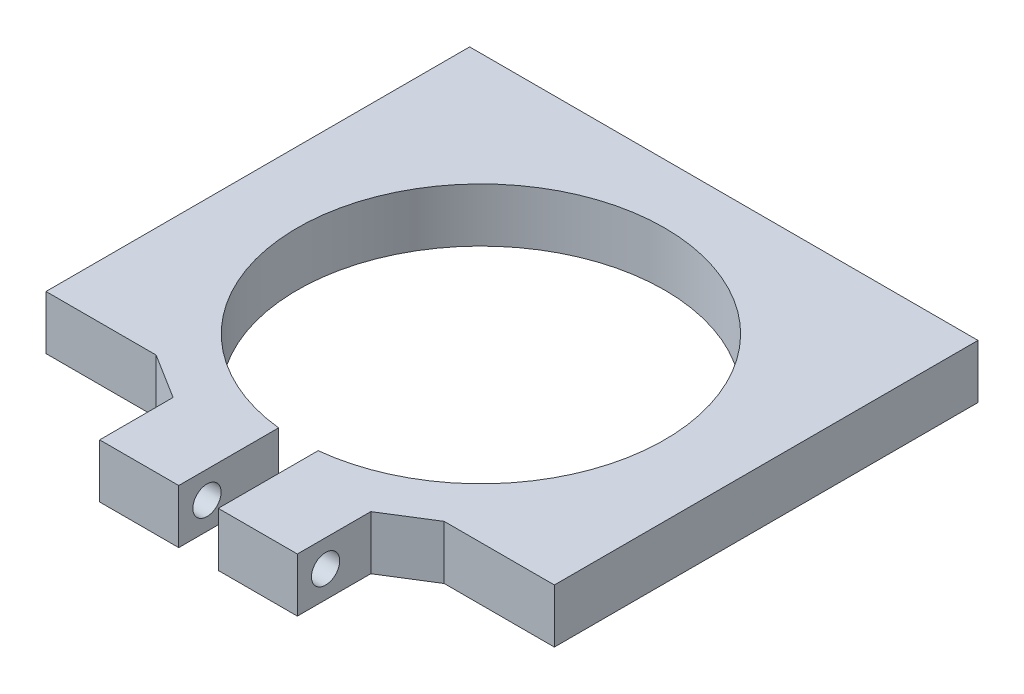
ISO-10303-21;
HEADER;
FILE_DESCRIPTION(('STEP AP214'),'2;1');
FILE_NAME('part.step','',(''),(''),'','','');
FILE_SCHEMA(('AUTOMOTIVE_DESIGN { 1 0 10303 214 1 1 1 1 }'));
ENDSEC;
DATA;
#1=APPLICATION_CONTEXT('core data for automotive mechanical design processes');
#2=APPLICATION_PROTOCOL_DEFINITION('international standard','automotive_design',2000,#1);
#3=PRODUCT_CONTEXT('',#1,'mechanical');
#4=PRODUCT('Part','Part','',(#3));
#5=PRODUCT_RELATED_PRODUCT_CATEGORY('part','',(#4));
#6=PRODUCT_DEFINITION_FORMATION('','',#4);
#7=PRODUCT_DEFINITION_CONTEXT('part definition',#1,'design');
#8=PRODUCT_DEFINITION('design','',#6,#7);
#9=PRODUCT_DEFINITION_SHAPE('','',#8);
#10=(LENGTH_UNIT() NAMED_UNIT(*) SI_UNIT(.MILLI.,.METRE.));
#11=(NAMED_UNIT(*) PLANE_ANGLE_UNIT() SI_UNIT($,.RADIAN.));
#12=(NAMED_UNIT(*) SI_UNIT($,.STERADIAN.) SOLID_ANGLE_UNIT());
#13=UNCERTAINTY_MEASURE_WITH_UNIT(LENGTH_MEASURE(1.E-05),#10,'distance_accuracy_value','');
#14=(GEOMETRIC_REPRESENTATION_CONTEXT(3) GLOBAL_UNCERTAINTY_ASSIGNED_CONTEXT((#13)) GLOBAL_UNIT_ASSIGNED_CONTEXT((#10,
#11,#12)) REPRESENTATION_CONTEXT('',''));
#15=CARTESIAN_POINT('',(0.,0.,0.));
#16=DIRECTION('',(0.,0.,1.));
#17=DIRECTION('',(1.,0.,0.));
#18=AXIS2_PLACEMENT_3D('',#15,#16,#17);
#19=CARTESIAN_POINT('',(-45.,9.53,46.5));
#20=DIRECTION('',(0.,0.,-1.));
#21=DIRECTION('',(-1.,0.,0.));
#22=AXIS2_PLACEMENT_3D('',#19,#20,#21);
#23=PLANE('',#22);
#24=DIRECTION('',(1.,0.,0.));
#25=VECTOR('',#24,1.);
#26=CARTESIAN_POINT('',(-45.,9.53,46.5));
#27=LINE('',#26,#25);
#28=CARTESIAN_POINT('',(3.50000000000001,9.53,46.5));
#29=VERTEX_POINT('',#28);
#30=CARTESIAN_POINT('',(17.5,9.53,46.5));
#31=VERTEX_POINT('',#30);
#32=EDGE_CURVE('E263',#29,#31,#27,.T.);
#33=ORIENTED_EDGE('',*,*,#32,.F.);
#34=DIRECTION('',(0.,1.,0.));
#35=VECTOR('',#34,1.);
#36=CARTESIAN_POINT('',(3.50000000000001,-0.000999999999999265,46.5));
#37=LINE('',#36,#35);
#38=CARTESIAN_POINT('',(3.50000000000001,0.,46.5));
#39=VERTEX_POINT('',#38);
#40=EDGE_CURVE('E201',#39,#29,#37,.T.);
#41=ORIENTED_EDGE('',*,*,#40,.F.);
#42=DIRECTION('',(1.,0.,0.));
#43=VECTOR('',#42,1.);
#44=CARTESIAN_POINT('',(-45.,0.,46.5));
#45=LINE('',#44,#43);
#46=CARTESIAN_POINT('',(17.5,0.,46.5));
#47=VERTEX_POINT('',#46);
#48=EDGE_CURVE('E272',#39,#47,#45,.T.);
#49=ORIENTED_EDGE('',*,*,#48,.T.);
#50=DIRECTION('',(0.,1.,0.));
#51=VECTOR('',#50,1.);
#52=CARTESIAN_POINT('',(17.5,-0.000999999999999265,46.5));
#53=LINE('',#52,#51);
#54=EDGE_CURVE('E221',#47,#31,#53,.T.);
#55=ORIENTED_EDGE('',*,*,#54,.T.);
#56=EDGE_LOOP('',(#33,#41,#49,#55));
#57=FACE_BOUND('',#56,.T.);
#58=ADVANCED_FACE('F32',(#57),#23,.F.);
#59=CARTESIAN_POINT('',(-45.,9.53,-46.5));
#60=DIRECTION('',(0.,0.,-1.));
#61=DIRECTION('',(-1.,0.,0.));
#62=AXIS2_PLACEMENT_3D('',#59,#60,#61);
#63=PLANE('',#62);
#64=CARTESIAN_POINT('',(-40.0000000000001,4.76500000000001,-46.5));
#65=DIRECTION('',(0.,0.,-1.));
#66=DIRECTION('',(-1.,0.,0.));
#67=AXIS2_PLACEMENT_3D('',#64,#65,#66);
#68=CIRCLE('',#67,2.);
#69=CARTESIAN_POINT('',(-42.0000000000001,4.76500000000001,-46.5));
#70=VERTEX_POINT('',#69);
#71=EDGE_CURVE('E224',#70,#70,#68,.T.);
#72=ORIENTED_EDGE('',*,*,#71,.F.);
#73=EDGE_LOOP('',(#72));
#74=FACE_BOUND('',#73,.T.);
#75=CARTESIAN_POINT('',(-25.,4.765,-46.5));
#76=DIRECTION('',(0.,0.,-1.));
#77=DIRECTION('',(-1.,0.,0.));
#78=AXIS2_PLACEMENT_3D('',#75,#76,#77);
#79=CIRCLE('',#78,2.);
#80=CARTESIAN_POINT('',(-27.,4.765,-46.5));
#81=VERTEX_POINT('',#80);
#82=EDGE_CURVE('E229',#81,#81,#79,.T.);
#83=ORIENTED_EDGE('',*,*,#82,.F.);
#84=EDGE_LOOP('',(#83));
#85=FACE_BOUND('',#84,.T.);
#86=CARTESIAN_POINT('',(25.,4.76499999999999,-46.5));
#87=DIRECTION('',(0.,0.,-1.));
#88=DIRECTION('',(-1.,0.,0.));
#89=AXIS2_PLACEMENT_3D('',#86,#87,#88);
#90=CIRCLE('',#89,2.);
#91=CARTESIAN_POINT('',(23.,4.76499999999999,-46.5));
#92=VERTEX_POINT('',#91);
#93=EDGE_CURVE('E235',#92,#92,#90,.T.);
#94=ORIENTED_EDGE('',*,*,#93,.F.);
#95=EDGE_LOOP('',(#94));
#96=FACE_BOUND('',#95,.T.);
#97=CARTESIAN_POINT('',(39.9999999999999,4.765,-46.5));
#98=DIRECTION('',(0.,0.,-1.));
#99=DIRECTION('',(-1.,0.,0.));
#100=AXIS2_PLACEMENT_3D('',#97,#98,#99);
#101=CIRCLE('',#100,2.);
#102=CARTESIAN_POINT('',(37.9999999999999,4.765,-46.5));
#103=VERTEX_POINT('',#102);
#104=EDGE_CURVE('E241',#103,#103,#101,.T.);
#105=ORIENTED_EDGE('',*,*,#104,.F.);
#106=EDGE_LOOP('',(#105));
#107=FACE_BOUND('',#106,.T.);
#108=DIRECTION('',(1.,0.,0.));
#109=VECTOR('',#108,1.);
#110=CARTESIAN_POINT('',(-45.,0.,-46.5));
#111=LINE('',#110,#109);
#112=CARTESIAN_POINT('',(-45.,0.,-46.5));
#113=VERTEX_POINT('',#112);
#114=CARTESIAN_POINT('',(45.,0.,-46.5));
#115=VERTEX_POINT('',#114);
#116=EDGE_CURVE('E253',#113,#115,#111,.T.);
#117=ORIENTED_EDGE('',*,*,#116,.F.);
#118=DIRECTION('',(0.,-1.,0.));
#119=VECTOR('',#118,1.);
#120=CARTESIAN_POINT('',(-45.,9.53,-46.5));
#121=LINE('',#120,#119);
#122=CARTESIAN_POINT('',(-45.,9.53,-46.5));
#123=VERTEX_POINT('',#122);
#124=EDGE_CURVE('E11',#123,#113,#121,.T.);
#125=ORIENTED_EDGE('',*,*,#124,.F.);
#126=DIRECTION('',(1.,0.,0.));
#127=VECTOR('',#126,1.);
#128=CARTESIAN_POINT('',(-45.,9.53,-46.5));
#129=LINE('',#128,#127);
#130=CARTESIAN_POINT('',(45.,9.53,-46.5));
#131=VERTEX_POINT('',#130);
#132=EDGE_CURVE('E256',#123,#131,#129,.T.);
#133=ORIENTED_EDGE('',*,*,#132,.T.);
#134=DIRECTION('',(0.,-1.,0.));
#135=VECTOR('',#134,1.);
#136=CARTESIAN_POINT('',(45.,9.53,-46.5));
#137=LINE('',#136,#135);
#138=EDGE_CURVE('E41',#131,#115,#137,.T.);
#139=ORIENTED_EDGE('',*,*,#138,.T.);
#140=EDGE_LOOP('',(#117,#125,#133,#139));
#141=FACE_BOUND('',#140,.T.);
#142=ADVANCED_FACE('F34',(#74,#85,#96,#107,#141),#63,.T.);
#143=CARTESIAN_POINT('',(-45.,9.53,-46.5));
#144=DIRECTION('',(1.,0.,0.));
#145=DIRECTION('',(0.,0.,-1.));
#146=AXIS2_PLACEMENT_3D('',#143,#144,#145);
#147=PLANE('',#146);
#148=DIRECTION('',(0.,0.,1.));
#149=VECTOR('',#148,1.);
#150=CARTESIAN_POINT('',(-45.,0.,-46.5));
#151=LINE('',#150,#149);
#152=CARTESIAN_POINT('',(-45.,0.,28.5));
#153=VERTEX_POINT('',#152);
#154=EDGE_CURVE('E260',#113,#153,#151,.T.);
#155=ORIENTED_EDGE('',*,*,#154,.T.);
#156=DIRECTION('',(0.,1.,0.));
#157=VECTOR('',#156,1.);
#158=CARTESIAN_POINT('',(-45.,0.,28.5));
#159=LINE('',#158,#157);
#160=CARTESIAN_POINT('',(-45.,9.53,28.5));
#161=VERTEX_POINT('',#160);
#162=EDGE_CURVE('E177',#153,#161,#159,.T.);
#163=ORIENTED_EDGE('',*,*,#162,.T.);
#164=DIRECTION('',(0.,0.,1.));
#165=VECTOR('',#164,1.);
#166=CARTESIAN_POINT('',(-45.,9.53,-46.5));
#167=LINE('',#166,#165);
#168=EDGE_CURVE('E267',#123,#161,#167,.T.);
#169=ORIENTED_EDGE('',*,*,#168,.F.);
#170=ORIENTED_EDGE('',*,*,#124,.T.);
#171=EDGE_LOOP('',(#155,#163,#169,#170));
#172=FACE_BOUND('',#171,.T.);
#173=ADVANCED_FACE('F286',(#172),#147,.F.);
#174=CARTESIAN_POINT('',(-17.5,0.,46.5));
#175=VERTEX_POINT('',#174);
#176=CARTESIAN_POINT('',(-3.49999999999999,0.,46.5));
#177=VERTEX_POINT('',#176);
#178=EDGE_CURVE('E273',#175,#177,#45,.T.);
#179=ORIENTED_EDGE('',*,*,#178,.T.);
#180=DIRECTION('',(0.,1.,0.));
#181=VECTOR('',#180,1.);
#182=CARTESIAN_POINT('',(-3.49999999999999,-0.000999999999999265,46.5));
#183=LINE('',#182,#181);
#184=CARTESIAN_POINT('',(-3.49999999999999,9.53,46.5));
#185=VERTEX_POINT('',#184);
#186=EDGE_CURVE('E200',#177,#185,#183,.T.);
#187=ORIENTED_EDGE('',*,*,#186,.T.);
#188=CARTESIAN_POINT('',(-17.5,9.53,46.5));
#189=VERTEX_POINT('',#188);
#190=EDGE_CURVE('E264',#189,#185,#27,.T.);
#191=ORIENTED_EDGE('',*,*,#190,.F.);
#192=DIRECTION('',(0.,1.,0.));
#193=VECTOR('',#192,1.);
#194=CARTESIAN_POINT('',(-17.5,-0.000999999999999265,46.5));
#195=LINE('',#194,#193);
#196=EDGE_CURVE('E212',#175,#189,#195,.T.);
#197=ORIENTED_EDGE('',*,*,#196,.F.);
#198=EDGE_LOOP('',(#179,#187,#191,#197));
#199=FACE_BOUND('',#198,.T.);
#200=ADVANCED_FACE('F308',(#199),#23,.F.);
#201=CARTESIAN_POINT('',(45.,9.53,-46.5));
#202=DIRECTION('',(1.,0.,0.));
#203=DIRECTION('',(0.,0.,-1.));
#204=AXIS2_PLACEMENT_3D('',#201,#202,#203);
#205=PLANE('',#204);
#206=DIRECTION('',(0.,1.,0.));
#207=VECTOR('',#206,1.);
#208=CARTESIAN_POINT('',(45.,0.,28.5));
#209=LINE('',#208,#207);
#210=CARTESIAN_POINT('',(45.,0.,28.5));
#211=VERTEX_POINT('',#210);
#212=CARTESIAN_POINT('',(45.,9.53,28.5));
#213=VERTEX_POINT('',#212);
#214=EDGE_CURVE('E143',#211,#213,#209,.T.);
#215=ORIENTED_EDGE('',*,*,#214,.F.);
#216=DIRECTION('',(0.,0.,1.));
#217=VECTOR('',#216,1.);
#218=CARTESIAN_POINT('',(45.,0.,-46.5));
#219=LINE('',#218,#217);
#220=EDGE_CURVE('E158',#115,#211,#219,.T.);
#221=ORIENTED_EDGE('',*,*,#220,.F.);
#222=ORIENTED_EDGE('',*,*,#138,.F.);
#223=DIRECTION('',(0.,0.,1.));
#224=VECTOR('',#223,1.);
#225=CARTESIAN_POINT('',(45.,9.53,-46.5));
#226=LINE('',#225,#224);
#227=EDGE_CURVE('E259',#131,#213,#226,.T.);
#228=ORIENTED_EDGE('',*,*,#227,.T.);
#229=EDGE_LOOP('',(#215,#221,#222,#228));
#230=FACE_BOUND('',#229,.T.);
#231=ADVANCED_FACE('F282',(#230),#205,.T.);
#232=CARTESIAN_POINT('',(45.,9.53,-46.5));
#233=DIRECTION('',(0.,-1.,0.));
#234=DIRECTION('',(0.,0.,-1.));
#235=AXIS2_PLACEMENT_3D('',#232,#233,#234);
#236=PLANE('',#235);
#237=DIRECTION('',(-0.847998304005087,0.,0.529998940003181));
#238=VECTOR('',#237,1.);
#239=CARTESIAN_POINT('',(25.5,9.53,28.5));
#240=LINE('',#239,#238);
#241=CARTESIAN_POINT('',(25.5,9.53,28.5));
#242=VERTEX_POINT('',#241);
#243=CARTESIAN_POINT('',(17.5,9.53,33.5));
#244=VERTEX_POINT('',#243);
#245=EDGE_CURVE('E159',#242,#244,#240,.T.);
#246=ORIENTED_EDGE('',*,*,#245,.F.);
#247=DIRECTION('',(-1.,0.,0.));
#248=VECTOR('',#247,1.);
#249=CARTESIAN_POINT('',(45.,9.53,28.5));
#250=LINE('',#249,#248);
#251=EDGE_CURVE('E140',#213,#242,#250,.T.);
#252=ORIENTED_EDGE('',*,*,#251,.F.);
#253=ORIENTED_EDGE('',*,*,#227,.F.);
#254=ORIENTED_EDGE('',*,*,#132,.F.);
#255=ORIENTED_EDGE('',*,*,#168,.T.);
#256=DIRECTION('',(-1.,0.,0.));
#257=VECTOR('',#256,1.);
#258=CARTESIAN_POINT('',(-45.,9.53,28.5));
#259=LINE('',#258,#257);
#260=CARTESIAN_POINT('',(-25.5,9.53,28.5));
#261=VERTEX_POINT('',#260);
#262=EDGE_CURVE('E170',#261,#161,#259,.T.);
#263=ORIENTED_EDGE('',*,*,#262,.F.);
#264=DIRECTION('',(-0.847998304005087,0.,-0.529998940003181));
#265=VECTOR('',#264,1.);
#266=CARTESIAN_POINT('',(-25.5,9.53,28.5));
#267=LINE('',#266,#265);
#268=CARTESIAN_POINT('',(-17.5,9.53,33.5));
#269=VERTEX_POINT('',#268);
#270=EDGE_CURVE('E164',#269,#261,#267,.T.);
#271=ORIENTED_EDGE('',*,*,#270,.F.);
#272=DIRECTION('',(0.,0.,-1.));
#273=VECTOR('',#272,1.);
#274=CARTESIAN_POINT('',(-17.5,9.53,46.5));
#275=LINE('',#274,#273);
#276=EDGE_CURVE('E209',#189,#269,#275,.T.);
#277=ORIENTED_EDGE('',*,*,#276,.F.);
#278=ORIENTED_EDGE('',*,*,#190,.T.);
#279=DIRECTION('',(0.,0.,1.));
#280=VECTOR('',#279,1.);
#281=CARTESIAN_POINT('',(-3.49999999999999,9.53,46.5));
#282=LINE('',#281,#280);
#283=CARTESIAN_POINT('',(-3.49999999999999,9.53,28.8210473221398));
#284=VERTEX_POINT('',#283);
#285=EDGE_CURVE('E198',#284,#185,#282,.T.);
#286=ORIENTED_EDGE('',*,*,#285,.F.);
#287=CARTESIAN_POINT('',(0.,9.53,-3.49999999999999));
#288=DIRECTION('',(0.,1.,0.));
#289=DIRECTION('',(0.,0.,1.));
#290=AXIS2_PLACEMENT_3D('',#287,#288,#289);
#291=CIRCLE('',#290,32.51);
#292=CARTESIAN_POINT('',(3.50000000000001,9.53,28.8210473221398));
#293=VERTEX_POINT('',#292);
#294=EDGE_CURVE('E247',#293,#284,#291,.T.);
#295=ORIENTED_EDGE('',*,*,#294,.F.);
#296=DIRECTION('',(0.,0.,-1.));
#297=VECTOR('',#296,1.);
#298=CARTESIAN_POINT('',(3.50000000000001,9.53,46.5));
#299=LINE('',#298,#297);
#300=EDGE_CURVE('E49',#29,#293,#299,.T.);
#301=ORIENTED_EDGE('',*,*,#300,.F.);
#302=ORIENTED_EDGE('',*,*,#32,.T.);
#303=DIRECTION('',(0.,0.,1.));
#304=VECTOR('',#303,1.);
#305=CARTESIAN_POINT('',(17.5,9.53,46.5));
#306=LINE('',#305,#304);
#307=EDGE_CURVE('E218',#244,#31,#306,.T.);
#308=ORIENTED_EDGE('',*,*,#307,.F.);
#309=EDGE_LOOP('',(#246,#252,#253,#254,#255,#263,#271,#277,#278,#286,#295,#301,#302,#308));
#310=FACE_BOUND('',#309,.T.);
#311=ADVANCED_FACE('F290',(#310),#236,.F.);
#312=CARTESIAN_POINT('',(45.,0.,-46.5));
#313=DIRECTION('',(0.,-1.,0.));
#314=DIRECTION('',(0.,0.,-1.));
#315=AXIS2_PLACEMENT_3D('',#312,#313,#314);
#316=PLANE('',#315);
#317=DIRECTION('',(-1.,0.,0.));
#318=VECTOR('',#317,1.);
#319=CARTESIAN_POINT('',(45.,0.,28.5));
#320=LINE('',#319,#318);
#321=CARTESIAN_POINT('',(25.5,0.,28.5));
#322=VERTEX_POINT('',#321);
#323=EDGE_CURVE('E137',#211,#322,#320,.T.);
#324=ORIENTED_EDGE('',*,*,#323,.T.);
#325=DIRECTION('',(-0.847998304005087,0.,0.529998940003181));
#326=VECTOR('',#325,1.);
#327=CARTESIAN_POINT('',(25.5,0.,28.5));
#328=LINE('',#327,#326);
#329=CARTESIAN_POINT('',(17.5,0.,33.5));
#330=VERTEX_POINT('',#329);
#331=EDGE_CURVE('E144',#322,#330,#328,.T.);
#332=ORIENTED_EDGE('',*,*,#331,.T.);
#333=DIRECTION('',(0.,0.,1.));
#334=VECTOR('',#333,1.);
#335=CARTESIAN_POINT('',(17.5,0.,46.5));
#336=LINE('',#335,#334);
#337=EDGE_CURVE('E215',#330,#47,#336,.T.);
#338=ORIENTED_EDGE('',*,*,#337,.T.);
#339=ORIENTED_EDGE('',*,*,#48,.F.);
#340=DIRECTION('',(0.,0.,-1.));
#341=VECTOR('',#340,1.);
#342=CARTESIAN_POINT('',(3.50000000000001,0.,46.5));
#343=LINE('',#342,#341);
#344=CARTESIAN_POINT('',(3.50000000000001,0.,28.8210473221398));
#345=VERTEX_POINT('',#344);
#346=EDGE_CURVE('E194',#39,#345,#343,.T.);
#347=ORIENTED_EDGE('',*,*,#346,.T.);
#348=CARTESIAN_POINT('',(0.,0.,-3.49999999999999));
#349=DIRECTION('',(0.,1.,0.));
#350=DIRECTION('',(0.,0.,1.));
#351=AXIS2_PLACEMENT_3D('',#348,#349,#350);
#352=CIRCLE('',#351,32.51);
#353=CARTESIAN_POINT('',(-3.49999999999999,0.,28.8210473221398));
#354=VERTEX_POINT('',#353);
#355=EDGE_CURVE('E250',#345,#354,#352,.T.);
#356=ORIENTED_EDGE('',*,*,#355,.T.);
#357=DIRECTION('',(0.,0.,1.));
#358=VECTOR('',#357,1.);
#359=CARTESIAN_POINT('',(-3.49999999999999,0.,46.5));
#360=LINE('',#359,#358);
#361=EDGE_CURVE('E57',#354,#177,#360,.T.);
#362=ORIENTED_EDGE('',*,*,#361,.T.);
#363=ORIENTED_EDGE('',*,*,#178,.F.);
#364=DIRECTION('',(0.,0.,-1.));
#365=VECTOR('',#364,1.);
#366=CARTESIAN_POINT('',(-17.5,0.,46.5));
#367=LINE('',#366,#365);
#368=CARTESIAN_POINT('',(-17.5,0.,33.5));
#369=VERTEX_POINT('',#368);
#370=EDGE_CURVE('E206',#175,#369,#367,.T.);
#371=ORIENTED_EDGE('',*,*,#370,.T.);
#372=DIRECTION('',(-0.847998304005087,0.,-0.529998940003181));
#373=VECTOR('',#372,1.);
#374=CARTESIAN_POINT('',(-25.5,0.,28.5));
#375=LINE('',#374,#373);
#376=CARTESIAN_POINT('',(-25.5,0.,28.5));
#377=VERTEX_POINT('',#376);
#378=EDGE_CURVE('E166',#369,#377,#375,.T.);
#379=ORIENTED_EDGE('',*,*,#378,.T.);
#380=DIRECTION('',(-1.,0.,0.));
#381=VECTOR('',#380,1.);
#382=CARTESIAN_POINT('',(-45.,0.,28.5));
#383=LINE('',#382,#381);
#384=EDGE_CURVE('E169',#377,#153,#383,.T.);
#385=ORIENTED_EDGE('',*,*,#384,.T.);
#386=ORIENTED_EDGE('',*,*,#154,.F.);
#387=ORIENTED_EDGE('',*,*,#116,.T.);
#388=ORIENTED_EDGE('',*,*,#220,.T.);
#389=EDGE_LOOP('',(#324,#332,#338,#339,#347,#356,#362,#363,#371,#379,#385,#386,#387,#388));
#390=FACE_BOUND('',#389,.T.);
#391=ADVANCED_FACE('F155',(#390),#316,.T.);
#392=CARTESIAN_POINT('',(0.,0.,-3.49999999999999));
#393=DIRECTION('',(0.,1.,0.));
#394=DIRECTION('',(0.,0.,1.));
#395=AXIS2_PLACEMENT_3D('',#392,#393,#394);
#396=CYLINDRICAL_SURFACE('',#395,32.51);
#397=ORIENTED_EDGE('',*,*,#355,.F.);
#398=DIRECTION('',(0.,1.,0.));
#399=VECTOR('',#398,1.);
#400=CARTESIAN_POINT('',(3.50000000000001,0.,28.8210473221398));
#401=LINE('',#400,#399);
#402=EDGE_CURVE('E192',#293,#345,#401,.F.);
#403=ORIENTED_EDGE('',*,*,#402,.F.);
#404=ORIENTED_EDGE('',*,*,#294,.T.);
#405=DIRECTION('',(0.,1.,0.));
#406=VECTOR('',#405,1.);
#407=CARTESIAN_POINT('',(-3.49999999999999,0.,28.8210473221398));
#408=LINE('',#407,#406);
#409=EDGE_CURVE('E190',#354,#284,#408,.T.);
#410=ORIENTED_EDGE('',*,*,#409,.F.);
#411=EDGE_LOOP('',(#397,#403,#404,#410));
#412=FACE_BOUND('',#411,.T.);
#413=ADVANCED_FACE('F304',(#412),#396,.F.);
#414=CARTESIAN_POINT('',(39.9999999999999,4.765,-27.5));
#415=DIRECTION('',(0.,0.,-1.));
#416=DIRECTION('',(-1.,0.,0.));
#417=AXIS2_PLACEMENT_3D('',#414,#415,#416);
#418=CYLINDRICAL_SURFACE('',#417,2.);
#419=CARTESIAN_POINT('',(39.9999999999999,4.765,-27.5));
#420=DIRECTION('',(0.,0.,-1.));
#421=DIRECTION('',(-1.,0.,0.));
#422=AXIS2_PLACEMENT_3D('',#419,#420,#421);
#423=CIRCLE('',#422,2.);
#424=CARTESIAN_POINT('',(37.9999999999999,4.765,-27.5));
#425=VERTEX_POINT('',#424);
#426=EDGE_CURVE('E244',#425,#425,#423,.T.);
#427=ORIENTED_EDGE('',*,*,#426,.F.);
#428=EDGE_LOOP('',(#427));
#429=FACE_BOUND('',#428,.T.);
#430=ORIENTED_EDGE('',*,*,#104,.T.);
#431=EDGE_LOOP('',(#430));
#432=FACE_BOUND('',#431,.T.);
#433=ADVANCED_FACE('F352',(#429,#432),#418,.F.);
#434=CARTESIAN_POINT('',(39.9999999999999,4.765,-27.5));
#435=DIRECTION('',(0.,0.,-1.));
#436=DIRECTION('',(-1.,0.,0.));
#437=AXIS2_PLACEMENT_3D('',#434,#435,#436);
#438=PLANE('',#437);
#439=ORIENTED_EDGE('',*,*,#426,.T.);
#440=EDGE_LOOP('',(#439));
#441=FACE_BOUND('',#440,.T.);
#442=ADVANCED_FACE('F355',(#441),#438,.T.);
#443=CARTESIAN_POINT('',(25.,4.76499999999999,-27.5));
#444=DIRECTION('',(0.,0.,-1.));
#445=DIRECTION('',(-1.,0.,0.));
#446=AXIS2_PLACEMENT_3D('',#443,#444,#445);
#447=CYLINDRICAL_SURFACE('',#446,2.);
#448=CARTESIAN_POINT('',(25.,4.76499999999999,-27.5));
#449=DIRECTION('',(0.,0.,-1.));
#450=DIRECTION('',(-1.,0.,0.));
#451=AXIS2_PLACEMENT_3D('',#448,#449,#450);
#452=CIRCLE('',#451,2.);
#453=CARTESIAN_POINT('',(23.,4.76499999999999,-27.5));
#454=VERTEX_POINT('',#453);
#455=EDGE_CURVE('E238',#454,#454,#452,.T.);
#456=ORIENTED_EDGE('',*,*,#455,.F.);
#457=EDGE_LOOP('',(#456));
#458=FACE_BOUND('',#457,.T.);
#459=ORIENTED_EDGE('',*,*,#93,.T.);
#460=EDGE_LOOP('',(#459));
#461=FACE_BOUND('',#460,.T.);
#462=ADVANCED_FACE('F359',(#458,#461),#447,.F.);
#463=CARTESIAN_POINT('',(25.,4.76499999999999,-27.5));
#464=DIRECTION('',(0.,0.,-1.));
#465=DIRECTION('',(-1.,0.,0.));
#466=AXIS2_PLACEMENT_3D('',#463,#464,#465);
#467=PLANE('',#466);
#468=ORIENTED_EDGE('',*,*,#455,.T.);
#469=EDGE_LOOP('',(#468));
#470=FACE_BOUND('',#469,.T.);
#471=ADVANCED_FACE('F363',(#470),#467,.T.);
#472=CARTESIAN_POINT('',(-25.,4.765,-27.5));
#473=DIRECTION('',(0.,0.,-1.));
#474=DIRECTION('',(-1.,0.,0.));
#475=AXIS2_PLACEMENT_3D('',#472,#473,#474);
#476=CYLINDRICAL_SURFACE('',#475,2.);
#477=CARTESIAN_POINT('',(-25.,4.765,-27.5));
#478=DIRECTION('',(0.,0.,-1.));
#479=DIRECTION('',(-1.,0.,0.));
#480=AXIS2_PLACEMENT_3D('',#477,#478,#479);
#481=CIRCLE('',#480,2.);
#482=CARTESIAN_POINT('',(-27.,4.765,-27.5));
#483=VERTEX_POINT('',#482);
#484=EDGE_CURVE('E232',#483,#483,#481,.T.);
#485=ORIENTED_EDGE('',*,*,#484,.F.);
#486=EDGE_LOOP('',(#485));
#487=FACE_BOUND('',#486,.T.);
#488=ORIENTED_EDGE('',*,*,#82,.T.);
#489=EDGE_LOOP('',(#488));
#490=FACE_BOUND('',#489,.T.);
#491=ADVANCED_FACE('F367',(#487,#490),#476,.F.);
#492=CARTESIAN_POINT('',(-25.,4.765,-27.5));
#493=DIRECTION('',(0.,0.,-1.));
#494=DIRECTION('',(-1.,0.,0.));
#495=AXIS2_PLACEMENT_3D('',#492,#493,#494);
#496=PLANE('',#495);
#497=ORIENTED_EDGE('',*,*,#484,.T.);
#498=EDGE_LOOP('',(#497));
#499=FACE_BOUND('',#498,.T.);
#500=ADVANCED_FACE('F371',(#499),#496,.T.);
#501=CARTESIAN_POINT('',(-40.0000000000001,4.76500000000001,-27.5));
#502=DIRECTION('',(0.,0.,-1.));
#503=DIRECTION('',(-1.,0.,0.));
#504=AXIS2_PLACEMENT_3D('',#501,#502,#503);
#505=CYLINDRICAL_SURFACE('',#504,2.);
#506=CARTESIAN_POINT('',(-40.0000000000001,4.76500000000001,-27.5));
#507=DIRECTION('',(0.,0.,-1.));
#508=DIRECTION('',(-1.,0.,0.));
#509=AXIS2_PLACEMENT_3D('',#506,#507,#508);
#510=CIRCLE('',#509,2.);
#511=CARTESIAN_POINT('',(-42.0000000000001,4.76500000000001,-27.5));
#512=VERTEX_POINT('',#511);
#513=EDGE_CURVE('E226',#512,#512,#510,.T.);
#514=ORIENTED_EDGE('',*,*,#513,.F.);
#515=EDGE_LOOP('',(#514));
#516=FACE_BOUND('',#515,.T.);
#517=ORIENTED_EDGE('',*,*,#71,.T.);
#518=EDGE_LOOP('',(#517));
#519=FACE_BOUND('',#518,.T.);
#520=ADVANCED_FACE('F375',(#516,#519),#505,.F.);
#521=CARTESIAN_POINT('',(-40.0000000000001,4.76500000000001,-27.5));
#522=DIRECTION('',(0.,0.,-1.));
#523=DIRECTION('',(-1.,0.,0.));
#524=AXIS2_PLACEMENT_3D('',#521,#522,#523);
#525=PLANE('',#524);
#526=ORIENTED_EDGE('',*,*,#513,.T.);
#527=EDGE_LOOP('',(#526));
#528=FACE_BOUND('',#527,.T.);
#529=ADVANCED_FACE('F379',(#528),#525,.T.);
#530=CARTESIAN_POINT('',(17.5,-0.000999999999999265,46.5));
#531=DIRECTION('',(-1.,0.,0.));
#532=DIRECTION('',(0.,0.,1.));
#533=AXIS2_PLACEMENT_3D('',#530,#531,#532);
#534=PLANE('',#533);
#535=CARTESIAN_POINT('',(17.5,4.765,41.5));
#536=DIRECTION('',(-1.,0.,0.));
#537=DIRECTION('',(0.,0.,1.));
#538=AXIS2_PLACEMENT_3D('',#535,#536,#537);
#539=CIRCLE('',#538,2.5);
#540=CARTESIAN_POINT('',(17.5,4.765,44.));
#541=VERTEX_POINT('',#540);
#542=EDGE_CURVE('E184',#541,#541,#539,.F.);
#543=ORIENTED_EDGE('',*,*,#542,.F.);
#544=EDGE_LOOP('',(#543));
#545=FACE_BOUND('',#544,.T.);
#546=DIRECTION('',(0.,1.,0.));
#547=VECTOR('',#546,1.);
#548=CARTESIAN_POINT('',(17.5,-0.000999999999999265,33.5));
#549=LINE('',#548,#547);
#550=EDGE_CURVE('E149',#330,#244,#549,.T.);
#551=ORIENTED_EDGE('',*,*,#550,.T.);
#552=ORIENTED_EDGE('',*,*,#307,.T.);
#553=ORIENTED_EDGE('',*,*,#54,.F.);
#554=ORIENTED_EDGE('',*,*,#337,.F.);
#555=EDGE_LOOP('',(#551,#552,#553,#554));
#556=FACE_BOUND('',#555,.T.);
#557=ADVANCED_FACE('F293',(#545,#556),#534,.F.);
#558=CARTESIAN_POINT('',(-17.5,-0.000999999999999265,46.5));
#559=DIRECTION('',(1.,0.,0.));
#560=DIRECTION('',(0.,0.,-1.));
#561=AXIS2_PLACEMENT_3D('',#558,#559,#560);
#562=PLANE('',#561);
#563=CARTESIAN_POINT('',(-17.5,4.765,41.5));
#564=DIRECTION('',(-1.,0.,0.));
#565=DIRECTION('',(0.,0.,1.));
#566=AXIS2_PLACEMENT_3D('',#563,#564,#565);
#567=CIRCLE('',#566,2.5);
#568=CARTESIAN_POINT('',(-17.5,4.765,44.));
#569=VERTEX_POINT('',#568);
#570=EDGE_CURVE('E180',#569,#569,#567,.T.);
#571=ORIENTED_EDGE('',*,*,#570,.F.);
#572=EDGE_LOOP('',(#571));
#573=FACE_BOUND('',#572,.T.);
#574=ORIENTED_EDGE('',*,*,#196,.T.);
#575=ORIENTED_EDGE('',*,*,#276,.T.);
#576=DIRECTION('',(0.,1.,0.));
#577=VECTOR('',#576,1.);
#578=CARTESIAN_POINT('',(-17.5,-0.000999999999999265,33.5));
#579=LINE('',#578,#577);
#580=EDGE_CURVE('E213',#369,#269,#579,.T.);
#581=ORIENTED_EDGE('',*,*,#580,.F.);
#582=ORIENTED_EDGE('',*,*,#370,.F.);
#583=EDGE_LOOP('',(#574,#575,#581,#582));
#584=FACE_BOUND('',#583,.T.);
#585=ADVANCED_FACE('F312',(#573,#584),#562,.F.);
#586=CARTESIAN_POINT('',(-3.49999999999999,-0.000999999999999265,46.5));
#587=DIRECTION('',(-1.,0.,0.));
#588=DIRECTION('',(0.,0.,1.));
#589=AXIS2_PLACEMENT_3D('',#586,#587,#588);
#590=PLANE('',#589);
#591=CARTESIAN_POINT('',(-3.5,4.765,41.5));
#592=DIRECTION('',(-1.,0.,0.));
#593=DIRECTION('',(0.,0.,1.));
#594=AXIS2_PLACEMENT_3D('',#591,#592,#593);
#595=CIRCLE('',#594,2.5);
#596=CARTESIAN_POINT('',(-3.5,4.765,44.));
#597=VERTEX_POINT('',#596);
#598=EDGE_CURVE('E187',#597,#597,#595,.T.);
#599=ORIENTED_EDGE('',*,*,#598,.T.);
#600=EDGE_LOOP('',(#599));
#601=FACE_BOUND('',#600,.T.);
#602=ORIENTED_EDGE('',*,*,#409,.T.);
#603=ORIENTED_EDGE('',*,*,#285,.T.);
#604=ORIENTED_EDGE('',*,*,#186,.F.);
#605=ORIENTED_EDGE('',*,*,#361,.F.);
#606=EDGE_LOOP('',(#602,#603,#604,#605));
#607=FACE_BOUND('',#606,.T.);
#608=ADVANCED_FACE('F389',(#601,#607),#590,.F.);
#609=CARTESIAN_POINT('',(3.50000000000001,-0.000999999999999265,46.5));
#610=DIRECTION('',(1.,0.,0.));
#611=DIRECTION('',(0.,0.,-1.));
#612=AXIS2_PLACEMENT_3D('',#609,#610,#611);
#613=PLANE('',#612);
#614=CARTESIAN_POINT('',(3.50000000000001,4.765,41.5));
#615=DIRECTION('',(1.,0.,0.));
#616=DIRECTION('',(0.,0.,-1.));
#617=AXIS2_PLACEMENT_3D('',#614,#615,#616);
#618=CIRCLE('',#617,2.5);
#619=CARTESIAN_POINT('',(3.50000000000001,4.765,39.));
#620=VERTEX_POINT('',#619);
#621=EDGE_CURVE('E36',#620,#620,#618,.T.);
#622=ORIENTED_EDGE('',*,*,#621,.T.);
#623=EDGE_LOOP('',(#622));
#624=FACE_BOUND('',#623,.T.);
#625=ORIENTED_EDGE('',*,*,#40,.T.);
#626=ORIENTED_EDGE('',*,*,#300,.T.);
#627=ORIENTED_EDGE('',*,*,#402,.T.);
#628=ORIENTED_EDGE('',*,*,#346,.F.);
#629=EDGE_LOOP('',(#625,#626,#627,#628));
#630=FACE_BOUND('',#629,.T.);
#631=ADVANCED_FACE('F300',(#624,#630),#613,.F.);
#632=CARTESIAN_POINT('',(24.5710678118655,4.765,41.5));
#633=DIRECTION('',(-1.,0.,0.));
#634=DIRECTION('',(0.,0.,1.));
#635=AXIS2_PLACEMENT_3D('',#632,#633,#634);
#636=CYLINDRICAL_SURFACE('',#635,2.5);
#637=ORIENTED_EDGE('',*,*,#542,.T.);
#638=EDGE_LOOP('',(#637));
#639=FACE_BOUND('',#638,.T.);
#640=ORIENTED_EDGE('',*,*,#621,.F.);
#641=EDGE_LOOP('',(#640));
#642=FACE_BOUND('',#641,.T.);
#643=ADVANCED_FACE('F327',(#639,#642),#636,.F.);
#644=ORIENTED_EDGE('',*,*,#570,.T.);
#645=EDGE_LOOP('',(#644));
#646=FACE_BOUND('',#645,.T.);
#647=ORIENTED_EDGE('',*,*,#598,.F.);
#648=EDGE_LOOP('',(#647));
#649=FACE_BOUND('',#648,.T.);
#650=ADVANCED_FACE('F320',(#646,#649),#636,.F.);
#651=CARTESIAN_POINT('',(-45.,0.,28.5));
#652=DIRECTION('',(0.,0.,-1.));
#653=DIRECTION('',(-1.,0.,0.));
#654=AXIS2_PLACEMENT_3D('',#651,#652,#653);
#655=PLANE('',#654);
#656=ORIENTED_EDGE('',*,*,#262,.T.);
#657=ORIENTED_EDGE('',*,*,#162,.F.);
#658=ORIENTED_EDGE('',*,*,#384,.F.);
#659=DIRECTION('',(0.,1.,0.));
#660=VECTOR('',#659,1.);
#661=CARTESIAN_POINT('',(-25.5,0.,28.5));
#662=LINE('',#661,#660);
#663=EDGE_CURVE('E173',#377,#261,#662,.T.);
#664=ORIENTED_EDGE('',*,*,#663,.T.);
#665=EDGE_LOOP('',(#656,#657,#658,#664));
#666=FACE_BOUND('',#665,.T.);
#667=ADVANCED_FACE('F318',(#666),#655,.F.);
#668=CARTESIAN_POINT('',(-25.5,0.,28.5));
#669=DIRECTION('',(0.529998940003181,0.,-0.847998304005088));
#670=DIRECTION('',(-0.847998304005088,0.,-0.529998940003181));
#671=AXIS2_PLACEMENT_3D('',#668,#669,#670);
#672=PLANE('',#671);
#673=ORIENTED_EDGE('',*,*,#270,.T.);
#674=ORIENTED_EDGE('',*,*,#663,.F.);
#675=ORIENTED_EDGE('',*,*,#378,.F.);
#676=ORIENTED_EDGE('',*,*,#580,.T.);
#677=EDGE_LOOP('',(#673,#674,#675,#676));
#678=FACE_BOUND('',#677,.T.);
#679=ADVANCED_FACE('F316',(#678),#672,.F.);
#680=CARTESIAN_POINT('',(45.,0.,28.5));
#681=DIRECTION('',(0.,0.,-1.));
#682=DIRECTION('',(-1.,0.,0.));
#683=AXIS2_PLACEMENT_3D('',#680,#681,#682);
#684=PLANE('',#683);
#685=ORIENTED_EDGE('',*,*,#251,.T.);
#686=DIRECTION('',(0.,1.,0.));
#687=VECTOR('',#686,1.);
#688=CARTESIAN_POINT('',(25.5,0.,28.5));
#689=LINE('',#688,#687);
#690=EDGE_CURVE('E133',#322,#242,#689,.T.);
#691=ORIENTED_EDGE('',*,*,#690,.F.);
#692=ORIENTED_EDGE('',*,*,#323,.F.);
#693=ORIENTED_EDGE('',*,*,#214,.T.);
#694=EDGE_LOOP('',(#685,#691,#692,#693));
#695=FACE_BOUND('',#694,.T.);
#696=ADVANCED_FACE('F135',(#695),#684,.F.);
#697=CARTESIAN_POINT('',(25.5,0.,28.5));
#698=DIRECTION('',(-0.529998940003181,0.,-0.847998304005088));
#699=DIRECTION('',(-0.847998304005088,0.,0.529998940003181));
#700=AXIS2_PLACEMENT_3D('',#697,#698,#699);
#701=PLANE('',#700);
#702=ORIENTED_EDGE('',*,*,#245,.T.);
#703=ORIENTED_EDGE('',*,*,#550,.F.);
#704=ORIENTED_EDGE('',*,*,#331,.F.);
#705=ORIENTED_EDGE('',*,*,#690,.T.);
#706=EDGE_LOOP('',(#702,#703,#704,#705));
#707=FACE_BOUND('',#706,.T.);
#708=ADVANCED_FACE('F147',(#707),#701,.F.);
#709=CLOSED_SHELL('',(#58,#142,#173,#200,#231,#311,#391,#413,#433,#442,#462,#471,#491,#500,#520,
#529,#557,#585,#608,#631,#643,#650,#667,#679,#696,#708));
#710=MANIFOLD_SOLID_BREP('B2',#709);
#711=ADVANCED_BREP_SHAPE_REPRESENTATION('',(#18,#710),#14);
#712=SHAPE_DEFINITION_REPRESENTATION(#9,#711);
ENDSEC;
END-ISO-10303-21;
